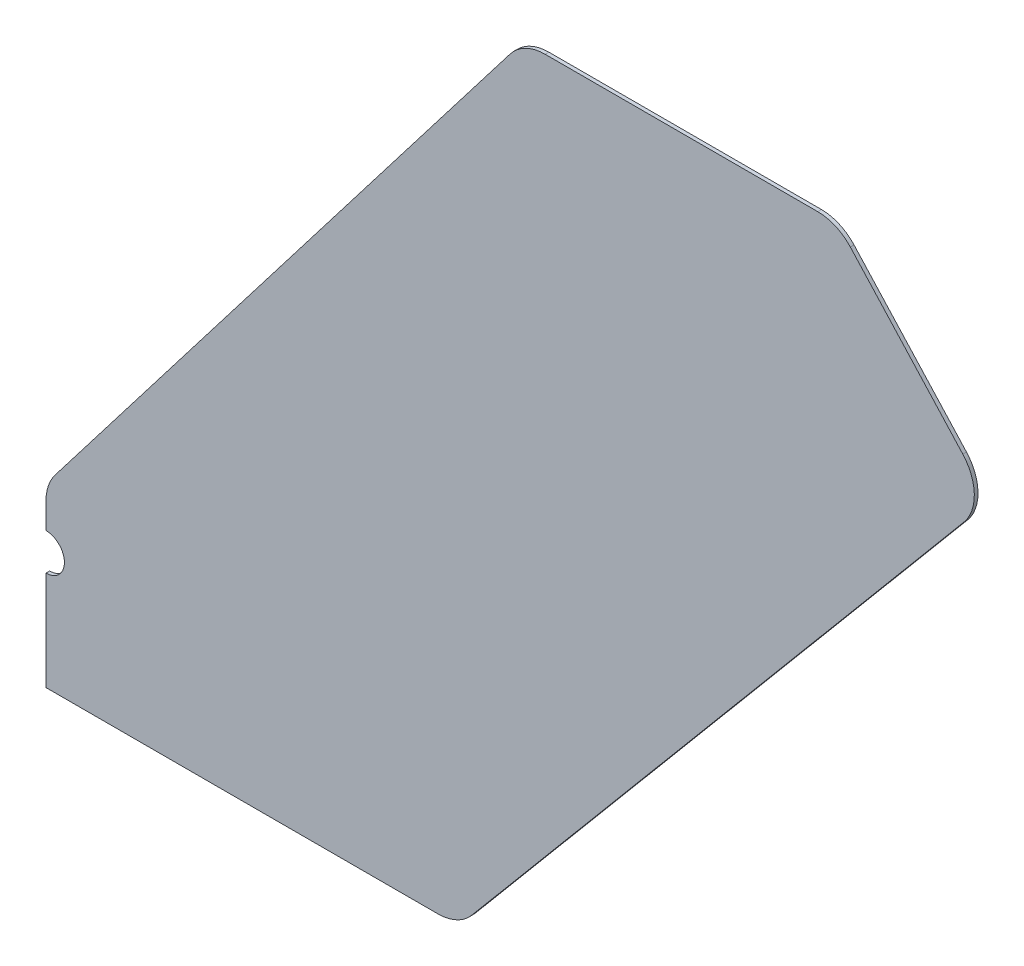
ISO-10303-21;
HEADER;
FILE_DESCRIPTION(('STEP AP214'),'2;1');
FILE_NAME('part.step','',(''),(''),'','','');
FILE_SCHEMA(('AUTOMOTIVE_DESIGN { 1 0 10303 214 1 1 1 1 }'));
ENDSEC;
DATA;
#1=APPLICATION_CONTEXT('core data for automotive mechanical design processes');
#2=APPLICATION_PROTOCOL_DEFINITION('international standard','automotive_design',2000,#1);
#3=PRODUCT_CONTEXT('',#1,'mechanical');
#4=PRODUCT('Part','Part','',(#3));
#5=PRODUCT_RELATED_PRODUCT_CATEGORY('part','',(#4));
#6=PRODUCT_DEFINITION_FORMATION('','',#4);
#7=PRODUCT_DEFINITION_CONTEXT('part definition',#1,'design');
#8=PRODUCT_DEFINITION('design','',#6,#7);
#9=PRODUCT_DEFINITION_SHAPE('','',#8);
#10=(LENGTH_UNIT() NAMED_UNIT(*) SI_UNIT(.MILLI.,.METRE.));
#11=(NAMED_UNIT(*) PLANE_ANGLE_UNIT() SI_UNIT($,.RADIAN.));
#12=(NAMED_UNIT(*) SI_UNIT($,.STERADIAN.) SOLID_ANGLE_UNIT());
#13=UNCERTAINTY_MEASURE_WITH_UNIT(LENGTH_MEASURE(1.E-05),#10,'distance_accuracy_value','');
#14=(GEOMETRIC_REPRESENTATION_CONTEXT(3) GLOBAL_UNCERTAINTY_ASSIGNED_CONTEXT((#13)) GLOBAL_UNIT_ASSIGNED_CONTEXT((#10,
#11,#12)) REPRESENTATION_CONTEXT('',''));
#15=CARTESIAN_POINT('',(0.,0.,0.));
#16=DIRECTION('',(0.,0.,1.));
#17=DIRECTION('',(1.,0.,0.));
#18=AXIS2_PLACEMENT_3D('',#15,#16,#17);
#19=CARTESIAN_POINT('',(-134.197014837806,1.11022302462516E-13,-2.5));
#20=DIRECTION('',(-1.,0.,0.));
#21=DIRECTION('',(0.,0.,1.));
#22=AXIS2_PLACEMENT_3D('',#19,#20,#21);
#23=PLANE('',#22);
#24=DIRECTION('',(0.,-1.,0.));
#25=VECTOR('',#24,1.);
#26=CARTESIAN_POINT('',(-134.197014837806,1.11022302462516E-13,0.));
#27=LINE('',#26,#25);
#28=CARTESIAN_POINT('',(-134.197014837806,67.3046921968263,0.));
#29=VERTEX_POINT('',#28);
#30=CARTESIAN_POINT('',(-134.197014837806,1.11022302462516E-13,0.));
#31=VERTEX_POINT('',#30);
#32=EDGE_CURVE('E167',#29,#31,#27,.T.);
#33=ORIENTED_EDGE('',*,*,#32,.F.);
#34=DIRECTION('',(0.,0.,1.));
#35=VECTOR('',#34,1.);
#36=CARTESIAN_POINT('',(-134.197014837806,67.3046921968263,-2.5));
#37=LINE('',#36,#35);
#38=CARTESIAN_POINT('',(-134.197014837806,67.3046921968263,-2.5));
#39=VERTEX_POINT('',#38);
#40=EDGE_CURVE('E11',#39,#29,#37,.T.);
#41=ORIENTED_EDGE('',*,*,#40,.F.);
#42=DIRECTION('',(0.,-1.,0.));
#43=VECTOR('',#42,1.);
#44=CARTESIAN_POINT('',(-134.197014837806,1.11022302462516E-13,-2.5));
#45=LINE('',#44,#43);
#46=CARTESIAN_POINT('',(-134.197014837806,1.11022302462516E-13,-2.5));
#47=VERTEX_POINT('',#46);
#48=EDGE_CURVE('E202',#39,#47,#45,.T.);
#49=ORIENTED_EDGE('',*,*,#48,.T.);
#50=DIRECTION('',(0.,0.,1.));
#51=VECTOR('',#50,1.);
#52=CARTESIAN_POINT('',(-134.197014837806,1.11022302462516E-13,-2.5));
#53=LINE('',#52,#51);
#54=EDGE_CURVE('E43',#47,#31,#53,.T.);
#55=ORIENTED_EDGE('',*,*,#54,.T.);
#56=EDGE_LOOP('',(#33,#41,#49,#55));
#57=FACE_BOUND('',#56,.T.);
#58=ADVANCED_FACE('F40',(#57),#23,.T.);
#59=CARTESIAN_POINT('',(-134.197014837806,79.8046921968263,-2.5));
#60=DIRECTION('',(0.,0.,1.));
#61=DIRECTION('',(1.,0.,0.));
#62=AXIS2_PLACEMENT_3D('',#59,#60,#61);
#63=CYLINDRICAL_SURFACE('',#62,12.5);
#64=CARTESIAN_POINT('',(-134.197014837806,79.8046921968263,0.));
#65=DIRECTION('',(0.,0.,-1.));
#66=DIRECTION('',(1.,0.,0.));
#67=AXIS2_PLACEMENT_3D('',#64,#65,#66);
#68=CIRCLE('',#67,12.5);
#69=CARTESIAN_POINT('',(-134.197014837806,92.3046921968263,0.));
#70=VERTEX_POINT('',#69);
#71=EDGE_CURVE('E200',#70,#29,#68,.T.);
#72=ORIENTED_EDGE('',*,*,#71,.F.);
#73=DIRECTION('',(0.,0.,1.));
#74=VECTOR('',#73,1.);
#75=CARTESIAN_POINT('',(-134.197014837806,92.3046921968263,-2.5));
#76=LINE('',#75,#74);
#77=CARTESIAN_POINT('',(-134.197014837806,92.3046921968263,-2.5));
#78=VERTEX_POINT('',#77);
#79=EDGE_CURVE('E49',#78,#70,#76,.T.);
#80=ORIENTED_EDGE('',*,*,#79,.F.);
#81=CARTESIAN_POINT('',(-134.197014837806,79.8046921968263,-2.5));
#82=DIRECTION('',(0.,0.,-1.));
#83=DIRECTION('',(1.,0.,0.));
#84=AXIS2_PLACEMENT_3D('',#81,#82,#83);
#85=CIRCLE('',#84,12.5);
#86=EDGE_CURVE('E157',#78,#39,#85,.T.);
#87=ORIENTED_EDGE('',*,*,#86,.T.);
#88=ORIENTED_EDGE('',*,*,#40,.T.);
#89=EDGE_LOOP('',(#72,#80,#87,#88));
#90=FACE_BOUND('',#89,.T.);
#91=ADVANCED_FACE('F224',(#90),#63,.F.);
#92=CARTESIAN_POINT('',(-134.197014837806,92.3046921968263,-2.5));
#93=DIRECTION('',(-1.,0.,0.));
#94=DIRECTION('',(0.,0.,1.));
#95=AXIS2_PLACEMENT_3D('',#92,#93,#94);
#96=PLANE('',#95);
#97=DIRECTION('',(0.,-1.,0.));
#98=VECTOR('',#97,1.);
#99=CARTESIAN_POINT('',(-134.197014837806,92.3046921968263,0.));
#100=LINE('',#99,#98);
#101=CARTESIAN_POINT('',(-134.197014837806,109.804692196826,0.));
#102=VERTEX_POINT('',#101);
#103=EDGE_CURVE('E144',#102,#70,#100,.T.);
#104=ORIENTED_EDGE('',*,*,#103,.F.);
#105=DIRECTION('',(0.,0.,1.));
#106=VECTOR('',#105,1.);
#107=CARTESIAN_POINT('',(-134.197014837806,109.804692196826,-2.5));
#108=LINE('',#107,#106);
#109=CARTESIAN_POINT('',(-134.197014837806,109.804692196826,-2.5));
#110=VERTEX_POINT('',#109);
#111=EDGE_CURVE('E139',#110,#102,#108,.T.);
#112=ORIENTED_EDGE('',*,*,#111,.F.);
#113=DIRECTION('',(0.,-1.,0.));
#114=VECTOR('',#113,1.);
#115=CARTESIAN_POINT('',(-134.197014837806,92.3046921968263,-2.5));
#116=LINE('',#115,#114);
#117=EDGE_CURVE('E142',#110,#78,#116,.T.);
#118=ORIENTED_EDGE('',*,*,#117,.T.);
#119=ORIENTED_EDGE('',*,*,#79,.T.);
#120=EDGE_LOOP('',(#104,#112,#118,#119));
#121=FACE_BOUND('',#120,.T.);
#122=ADVANCED_FACE('F141',(#121),#96,.T.);
#123=CARTESIAN_POINT('',(-104.197014837806,109.804692196826,-2.5));
#124=DIRECTION('',(0.,0.,1.));
#125=DIRECTION('',(1.,0.,0.));
#126=AXIS2_PLACEMENT_3D('',#123,#124,#125);
#127=CYLINDRICAL_SURFACE('',#126,30.);
#128=CARTESIAN_POINT('',(-104.197014837806,109.804692196826,0.));
#129=DIRECTION('',(0.,0.,1.));
#130=DIRECTION('',(-1.,0.,0.));
#131=AXIS2_PLACEMENT_3D('',#128,#129,#130);
#132=CIRCLE('',#131,30.);
#133=CARTESIAN_POINT('',(-127.984859377963,128.084146568698,0.));
#134=VERTEX_POINT('',#133);
#135=EDGE_CURVE('E197',#134,#102,#132,.T.);
#136=ORIENTED_EDGE('',*,*,#135,.F.);
#137=DIRECTION('',(0.,0.,1.));
#138=VECTOR('',#137,1.);
#139=CARTESIAN_POINT('',(-127.984859377963,128.084146568698,-2.5));
#140=LINE('',#139,#138);
#141=CARTESIAN_POINT('',(-127.984859377963,128.084146568698,-2.5));
#142=VERTEX_POINT('',#141);
#143=EDGE_CURVE('E149',#142,#134,#140,.T.);
#144=ORIENTED_EDGE('',*,*,#143,.F.);
#145=CARTESIAN_POINT('',(-104.197014837806,109.804692196826,-2.5));
#146=DIRECTION('',(0.,0.,1.));
#147=DIRECTION('',(-1.,0.,0.));
#148=AXIS2_PLACEMENT_3D('',#145,#146,#147);
#149=CIRCLE('',#148,30.);
#150=EDGE_CURVE('E155',#142,#110,#149,.T.);
#151=ORIENTED_EDGE('',*,*,#150,.T.);
#152=ORIENTED_EDGE('',*,*,#111,.T.);
#153=EDGE_LOOP('',(#136,#144,#151,#152));
#154=FACE_BOUND('',#153,.T.);
#155=ADVANCED_FACE('F159',(#154),#127,.T.);
#156=CARTESIAN_POINT('',(-127.984859377963,128.084146568698,-2.5));
#157=DIRECTION('',(-0.792928151338553,0.609315145729059,0.));
#158=DIRECTION('',(-0.609315145729059,-0.792928151338553,0.));
#159=AXIS2_PLACEMENT_3D('',#156,#157,#158);
#160=PLANE('',#159);
#161=DIRECTION('',(-0.609315145729059,-0.792928151338553,0.));
#162=VECTOR('',#161,1.);
#163=CARTESIAN_POINT('',(-127.984859377963,128.084146568698,0.));
#164=LINE('',#163,#162);
#165=CARTESIAN_POINT('',(180.842467764242,529.974503816741,0.));
#166=VERTEX_POINT('',#165);
#167=EDGE_CURVE('E194',#166,#134,#164,.T.);
#168=ORIENTED_EDGE('',*,*,#167,.F.);
#169=DIRECTION('',(0.,0.,1.));
#170=VECTOR('',#169,1.);
#171=CARTESIAN_POINT('',(180.842467764242,529.974503816741,-2.5));
#172=LINE('',#171,#170);
#173=CARTESIAN_POINT('',(180.842467764242,529.974503816741,-2.5));
#174=VERTEX_POINT('',#173);
#175=EDGE_CURVE('E206',#174,#166,#172,.T.);
#176=ORIENTED_EDGE('',*,*,#175,.F.);
#177=DIRECTION('',(-0.609315145729059,-0.792928151338553,0.));
#178=VECTOR('',#177,1.);
#179=CARTESIAN_POINT('',(-127.984859377963,128.084146568698,-2.5));
#180=LINE('',#179,#178);
#181=EDGE_CURVE('E160',#174,#142,#180,.T.);
#182=ORIENTED_EDGE('',*,*,#181,.T.);
#183=ORIENTED_EDGE('',*,*,#143,.T.);
#184=EDGE_LOOP('',(#168,#176,#182,#183));
#185=FACE_BOUND('',#184,.T.);
#186=ADVANCED_FACE('F237',(#185),#160,.T.);
#187=CARTESIAN_POINT('',(204.630312304398,511.69504944487,-2.5));
#188=DIRECTION('',(0.,0.,1.));
#189=DIRECTION('',(1.,0.,0.));
#190=AXIS2_PLACEMENT_3D('',#187,#188,#189);
#191=CYLINDRICAL_SURFACE('',#190,30.);
#192=CARTESIAN_POINT('',(204.630312304398,511.69504944487,0.));
#193=DIRECTION('',(0.,0.,1.));
#194=DIRECTION('',(-1.,0.,0.));
#195=AXIS2_PLACEMENT_3D('',#192,#193,#194);
#196=CIRCLE('',#195,30.);
#197=CARTESIAN_POINT('',(204.630312304399,541.69504944487,0.));
#198=VERTEX_POINT('',#197);
#199=EDGE_CURVE('E191',#198,#166,#196,.T.);
#200=ORIENTED_EDGE('',*,*,#199,.F.);
#201=DIRECTION('',(0.,0.,1.));
#202=VECTOR('',#201,1.);
#203=CARTESIAN_POINT('',(204.630312304399,541.69504944487,-2.5));
#204=LINE('',#203,#202);
#205=CARTESIAN_POINT('',(204.630312304399,541.69504944487,-2.5));
#206=VERTEX_POINT('',#205);
#207=EDGE_CURVE('E208',#206,#198,#204,.T.);
#208=ORIENTED_EDGE('',*,*,#207,.F.);
#209=CARTESIAN_POINT('',(204.630312304398,511.69504944487,-2.5));
#210=DIRECTION('',(0.,0.,1.));
#211=DIRECTION('',(-1.,0.,0.));
#212=AXIS2_PLACEMENT_3D('',#209,#210,#211);
#213=CIRCLE('',#212,30.);
#214=EDGE_CURVE('E162',#206,#174,#213,.T.);
#215=ORIENTED_EDGE('',*,*,#214,.T.);
#216=ORIENTED_EDGE('',*,*,#175,.T.);
#217=EDGE_LOOP('',(#200,#208,#215,#216));
#218=FACE_BOUND('',#217,.T.);
#219=ADVANCED_FACE('F240',(#218),#191,.T.);
#220=CARTESIAN_POINT('',(204.630312304399,541.69504944487,-2.5));
#221=DIRECTION('',(0.,1.,0.));
#222=DIRECTION('',(-1.,0.,0.));
#223=AXIS2_PLACEMENT_3D('',#220,#221,#222);
#224=PLANE('',#223);
#225=DIRECTION('',(-1.,0.,0.));
#226=VECTOR('',#225,1.);
#227=CARTESIAN_POINT('',(204.630312304399,541.69504944487,0.));
#228=LINE('',#227,#226);
#229=CARTESIAN_POINT('',(389.61709122559,541.695049444869,0.));
#230=VERTEX_POINT('',#229);
#231=EDGE_CURVE('E188',#230,#198,#228,.T.);
#232=ORIENTED_EDGE('',*,*,#231,.F.);
#233=DIRECTION('',(0.,0.,1.));
#234=VECTOR('',#233,1.);
#235=CARTESIAN_POINT('',(389.61709122559,541.695049444869,-2.5));
#236=LINE('',#235,#234);
#237=CARTESIAN_POINT('',(389.61709122559,541.695049444869,-2.5));
#238=VERTEX_POINT('',#237);
#239=EDGE_CURVE('E210',#238,#230,#236,.T.);
#240=ORIENTED_EDGE('',*,*,#239,.F.);
#241=DIRECTION('',(-1.,0.,0.));
#242=VECTOR('',#241,1.);
#243=CARTESIAN_POINT('',(204.630312304399,541.69504944487,-2.5));
#244=LINE('',#243,#242);
#245=EDGE_CURVE('E410',#238,#206,#244,.T.);
#246=ORIENTED_EDGE('',*,*,#245,.T.);
#247=ORIENTED_EDGE('',*,*,#207,.T.);
#248=EDGE_LOOP('',(#232,#240,#246,#247));
#249=FACE_BOUND('',#248,.T.);
#250=ADVANCED_FACE('F244',(#249),#224,.T.);
#251=CARTESIAN_POINT('',(389.617091225591,511.695049444869,-2.5));
#252=DIRECTION('',(0.,0.,1.));
#253=DIRECTION('',(1.,0.,0.));
#254=AXIS2_PLACEMENT_3D('',#251,#252,#253);
#255=CYLINDRICAL_SURFACE('',#254,30.);
#256=CARTESIAN_POINT('',(389.617091225591,511.695049444869,0.));
#257=DIRECTION('',(0.,0.,1.));
#258=DIRECTION('',(-1.,0.,0.));
#259=AXIS2_PLACEMENT_3D('',#256,#257,#258);
#260=CIRCLE('',#259,30.);
#261=CARTESIAN_POINT('',(411.771088083949,531.923752398837,0.));
#262=VERTEX_POINT('',#261);
#263=EDGE_CURVE('E185',#262,#230,#260,.T.);
#264=ORIENTED_EDGE('',*,*,#263,.F.);
#265=DIRECTION('',(0.,0.,1.));
#266=VECTOR('',#265,1.);
#267=CARTESIAN_POINT('',(411.771088083949,531.923752398837,-2.5));
#268=LINE('',#267,#266);
#269=CARTESIAN_POINT('',(411.771088083949,531.923752398837,-2.5));
#270=VERTEX_POINT('',#269);
#271=EDGE_CURVE('E212',#270,#262,#268,.T.);
#272=ORIENTED_EDGE('',*,*,#271,.F.);
#273=CARTESIAN_POINT('',(389.617091225591,511.695049444869,-2.5));
#274=DIRECTION('',(0.,0.,1.));
#275=DIRECTION('',(-1.,0.,0.));
#276=AXIS2_PLACEMENT_3D('',#273,#274,#275);
#277=CIRCLE('',#276,30.);
#278=EDGE_CURVE('E406',#270,#238,#277,.T.);
#279=ORIENTED_EDGE('',*,*,#278,.T.);
#280=ORIENTED_EDGE('',*,*,#239,.T.);
#281=EDGE_LOOP('',(#264,#272,#279,#280));
#282=FACE_BOUND('',#281,.T.);
#283=ADVANCED_FACE('F248',(#282),#255,.T.);
#284=CARTESIAN_POINT('',(488.055453139466,448.378920699665,-2.5));
#285=DIRECTION('',(0.73846656194527,0.674290098465589,0.));
#286=DIRECTION('',(-0.674290098465589,0.73846656194527,0.));
#287=AXIS2_PLACEMENT_3D('',#284,#285,#286);
#288=PLANE('',#287);
#289=DIRECTION('',(-0.674290098465588,0.73846656194527,0.));
#290=VECTOR('',#289,1.);
#291=CARTESIAN_POINT('',(488.055453139466,448.378920699665,0.));
#292=LINE('',#291,#290);
#293=CARTESIAN_POINT('',(488.055453139466,448.378920699665,0.));
#294=VERTEX_POINT('',#293);
#295=EDGE_CURVE('E182',#294,#262,#292,.T.);
#296=ORIENTED_EDGE('',*,*,#295,.F.);
#297=DIRECTION('',(0.,0.,1.));
#298=VECTOR('',#297,1.);
#299=CARTESIAN_POINT('',(488.055453139466,448.378920699665,-2.5));
#300=LINE('',#299,#298);
#301=CARTESIAN_POINT('',(488.055453139466,448.378920699665,-2.5));
#302=VERTEX_POINT('',#301);
#303=EDGE_CURVE('E214',#302,#294,#300,.T.);
#304=ORIENTED_EDGE('',*,*,#303,.F.);
#305=DIRECTION('',(-0.674290098465588,0.73846656194527,0.));
#306=VECTOR('',#305,1.);
#307=CARTESIAN_POINT('',(488.055453139466,448.378920699665,-2.5));
#308=LINE('',#307,#306);
#309=EDGE_CURVE('E417',#302,#270,#308,.T.);
#310=ORIENTED_EDGE('',*,*,#309,.T.);
#311=ORIENTED_EDGE('',*,*,#271,.T.);
#312=EDGE_LOOP('',(#296,#304,#310,#311));
#313=FACE_BOUND('',#312,.T.);
#314=ADVANCED_FACE('F252',(#313),#288,.T.);
#315=CARTESIAN_POINT('',(465.901456281108,428.150217745697,-2.5));
#316=DIRECTION('',(0.,0.,1.));
#317=DIRECTION('',(1.,0.,0.));
#318=AXIS2_PLACEMENT_3D('',#315,#316,#317);
#319=CYLINDRICAL_SURFACE('',#318,30.);
#320=CARTESIAN_POINT('',(465.901456281108,428.150217745697,0.));
#321=DIRECTION('',(0.,0.,1.));
#322=DIRECTION('',(1.,0.,0.));
#323=AXIS2_PLACEMENT_3D('',#320,#321,#322);
#324=CIRCLE('',#323,30.);
#325=CARTESIAN_POINT('',(488.882789574677,408.866589455101,0.));
#326=VERTEX_POINT('',#325);
#327=EDGE_CURVE('E179',#326,#294,#324,.T.);
#328=ORIENTED_EDGE('',*,*,#327,.F.);
#329=DIRECTION('',(0.,0.,1.));
#330=VECTOR('',#329,1.);
#331=CARTESIAN_POINT('',(488.882789574677,408.866589455101,-2.5));
#332=LINE('',#331,#330);
#333=CARTESIAN_POINT('',(488.882789574677,408.866589455101,-2.5));
#334=VERTEX_POINT('',#333);
#335=EDGE_CURVE('E216',#334,#326,#332,.T.);
#336=ORIENTED_EDGE('',*,*,#335,.F.);
#337=CARTESIAN_POINT('',(465.901456281108,428.150217745697,-2.5));
#338=DIRECTION('',(0.,0.,1.));
#339=DIRECTION('',(1.,0.,0.));
#340=AXIS2_PLACEMENT_3D('',#337,#338,#339);
#341=CIRCLE('',#340,30.);
#342=EDGE_CURVE('E399',#334,#302,#341,.T.);
#343=ORIENTED_EDGE('',*,*,#342,.T.);
#344=ORIENTED_EDGE('',*,*,#303,.T.);
#345=EDGE_LOOP('',(#328,#336,#343,#344));
#346=FACE_BOUND('',#345,.T.);
#347=ADVANCED_FACE('F256',(#346),#319,.T.);
#348=CARTESIAN_POINT('',(154.795088711113,10.716371709404,-2.5));
#349=DIRECTION('',(0.766044443118982,-0.642787609686535,0.));
#350=DIRECTION('',(0.642787609686535,0.766044443118982,0.));
#351=AXIS2_PLACEMENT_3D('',#348,#349,#350);
#352=PLANE('',#351);
#353=DIRECTION('',(0.642787609686535,0.766044443118982,0.));
#354=VECTOR('',#353,1.);
#355=CARTESIAN_POINT('',(154.795088711113,10.716371709404,0.));
#356=LINE('',#355,#354);
#357=CARTESIAN_POINT('',(154.795088711113,10.716371709404,0.));
#358=VERTEX_POINT('',#357);
#359=EDGE_CURVE('E176',#358,#326,#356,.T.);
#360=ORIENTED_EDGE('',*,*,#359,.F.);
#361=DIRECTION('',(0.,0.,1.));
#362=VECTOR('',#361,1.);
#363=CARTESIAN_POINT('',(154.795088711113,10.716371709404,-2.5));
#364=LINE('',#363,#362);
#365=CARTESIAN_POINT('',(154.795088711113,10.716371709404,-2.5));
#366=VERTEX_POINT('',#365);
#367=EDGE_CURVE('E218',#366,#358,#364,.T.);
#368=ORIENTED_EDGE('',*,*,#367,.F.);
#369=DIRECTION('',(0.642787609686535,0.766044443118982,0.));
#370=VECTOR('',#369,1.);
#371=CARTESIAN_POINT('',(154.795088711113,10.716371709404,-2.5));
#372=LINE('',#371,#370);
#373=EDGE_CURVE('E395',#366,#334,#372,.T.);
#374=ORIENTED_EDGE('',*,*,#373,.T.);
#375=ORIENTED_EDGE('',*,*,#335,.T.);
#376=EDGE_LOOP('',(#360,#368,#374,#375));
#377=FACE_BOUND('',#376,.T.);
#378=ADVANCED_FACE('F260',(#377),#352,.T.);
#379=CARTESIAN_POINT('',(131.813755417544,30.,-2.5));
#380=DIRECTION('',(0.,0.,1.));
#381=DIRECTION('',(1.,0.,0.));
#382=AXIS2_PLACEMENT_3D('',#379,#380,#381);
#383=CYLINDRICAL_SURFACE('',#382,30.);
#384=CARTESIAN_POINT('',(131.813755417544,30.,0.));
#385=DIRECTION('',(0.,0.,1.));
#386=DIRECTION('',(1.,0.,0.));
#387=AXIS2_PLACEMENT_3D('',#384,#385,#386);
#388=CIRCLE('',#387,30.);
#389=CARTESIAN_POINT('',(131.813755417544,0.,0.));
#390=VERTEX_POINT('',#389);
#391=EDGE_CURVE('E173',#390,#358,#388,.T.);
#392=ORIENTED_EDGE('',*,*,#391,.F.);
#393=DIRECTION('',(0.,0.,1.));
#394=VECTOR('',#393,1.);
#395=CARTESIAN_POINT('',(131.813755417544,0.,-2.5));
#396=LINE('',#395,#394);
#397=CARTESIAN_POINT('',(131.813755417544,0.,-2.5));
#398=VERTEX_POINT('',#397);
#399=EDGE_CURVE('E219',#398,#390,#396,.T.);
#400=ORIENTED_EDGE('',*,*,#399,.F.);
#401=CARTESIAN_POINT('',(131.813755417544,30.,-2.5));
#402=DIRECTION('',(0.,0.,1.));
#403=DIRECTION('',(1.,0.,0.));
#404=AXIS2_PLACEMENT_3D('',#401,#402,#403);
#405=CIRCLE('',#404,30.);
#406=EDGE_CURVE('E421',#398,#366,#405,.T.);
#407=ORIENTED_EDGE('',*,*,#406,.T.);
#408=ORIENTED_EDGE('',*,*,#367,.T.);
#409=EDGE_LOOP('',(#392,#400,#407,#408));
#410=FACE_BOUND('',#409,.T.);
#411=ADVANCED_FACE('F264',(#410),#383,.T.);
#412=CARTESIAN_POINT('',(-134.197014837806,1.11022302462516E-13,-2.5));
#413=DIRECTION('',(0.,-1.,0.));
#414=DIRECTION('',(1.,0.,0.));
#415=AXIS2_PLACEMENT_3D('',#412,#413,#414);
#416=PLANE('',#415);
#417=DIRECTION('',(1.,0.,0.));
#418=VECTOR('',#417,1.);
#419=CARTESIAN_POINT('',(-134.197014837806,1.11022302462516E-13,0.));
#420=LINE('',#419,#418);
#421=EDGE_CURVE('E170',#31,#390,#420,.T.);
#422=ORIENTED_EDGE('',*,*,#421,.F.);
#423=ORIENTED_EDGE('',*,*,#54,.F.);
#424=DIRECTION('',(1.,0.,0.));
#425=VECTOR('',#424,1.);
#426=CARTESIAN_POINT('',(-134.197014837806,1.11022302462516E-13,-2.5));
#427=LINE('',#426,#425);
#428=EDGE_CURVE('E423',#47,#398,#427,.T.);
#429=ORIENTED_EDGE('',*,*,#428,.T.);
#430=ORIENTED_EDGE('',*,*,#399,.T.);
#431=EDGE_LOOP('',(#422,#423,#429,#430));
#432=FACE_BOUND('',#431,.T.);
#433=ADVANCED_FACE('F221',(#432),#416,.T.);
#434=CARTESIAN_POINT('',(-134.197014837806,79.8046921968263,-2.5));
#435=DIRECTION('',(0.,0.,1.));
#436=DIRECTION('',(1.,0.,0.));
#437=AXIS2_PLACEMENT_3D('',#434,#435,#436);
#438=PLANE('',#437);
#439=ORIENTED_EDGE('',*,*,#48,.F.);
#440=ORIENTED_EDGE('',*,*,#86,.F.);
#441=ORIENTED_EDGE('',*,*,#117,.F.);
#442=ORIENTED_EDGE('',*,*,#150,.F.);
#443=ORIENTED_EDGE('',*,*,#181,.F.);
#444=ORIENTED_EDGE('',*,*,#214,.F.);
#445=ORIENTED_EDGE('',*,*,#245,.F.);
#446=ORIENTED_EDGE('',*,*,#278,.F.);
#447=ORIENTED_EDGE('',*,*,#309,.F.);
#448=ORIENTED_EDGE('',*,*,#342,.F.);
#449=ORIENTED_EDGE('',*,*,#373,.F.);
#450=ORIENTED_EDGE('',*,*,#406,.F.);
#451=ORIENTED_EDGE('',*,*,#428,.F.);
#452=EDGE_LOOP('',(#439,#440,#441,#442,#443,#444,#445,#446,#447,#448,#449,#450,#451));
#453=FACE_BOUND('',#452,.T.);
#454=ADVANCED_FACE('F153',(#453),#438,.F.);
#455=CARTESIAN_POINT('',(-134.197014837806,79.8046921968263,0.));
#456=DIRECTION('',(0.,0.,1.));
#457=DIRECTION('',(1.,0.,0.));
#458=AXIS2_PLACEMENT_3D('',#455,#456,#457);
#459=PLANE('',#458);
#460=ORIENTED_EDGE('',*,*,#32,.T.);
#461=ORIENTED_EDGE('',*,*,#421,.T.);
#462=ORIENTED_EDGE('',*,*,#391,.T.);
#463=ORIENTED_EDGE('',*,*,#359,.T.);
#464=ORIENTED_EDGE('',*,*,#327,.T.);
#465=ORIENTED_EDGE('',*,*,#295,.T.);
#466=ORIENTED_EDGE('',*,*,#263,.T.);
#467=ORIENTED_EDGE('',*,*,#231,.T.);
#468=ORIENTED_EDGE('',*,*,#199,.T.);
#469=ORIENTED_EDGE('',*,*,#167,.T.);
#470=ORIENTED_EDGE('',*,*,#135,.T.);
#471=ORIENTED_EDGE('',*,*,#103,.T.);
#472=ORIENTED_EDGE('',*,*,#71,.T.);
#473=EDGE_LOOP('',(#460,#461,#462,#463,#464,#465,#466,#467,#468,#469,#470,#471,#472));
#474=FACE_BOUND('',#473,.T.);
#475=ADVANCED_FACE('F223',(#474),#459,.T.);
#476=CLOSED_SHELL('',(#58,#91,#122,#155,#186,#219,#250,#283,#314,#347,#378,#411,#433,#454,#475));
#477=MANIFOLD_SOLID_BREP('B2',#476);
#478=ADVANCED_BREP_SHAPE_REPRESENTATION('',(#18,#477),#14);
#479=SHAPE_DEFINITION_REPRESENTATION(#9,#478);
ENDSEC;
END-ISO-10303-21;
